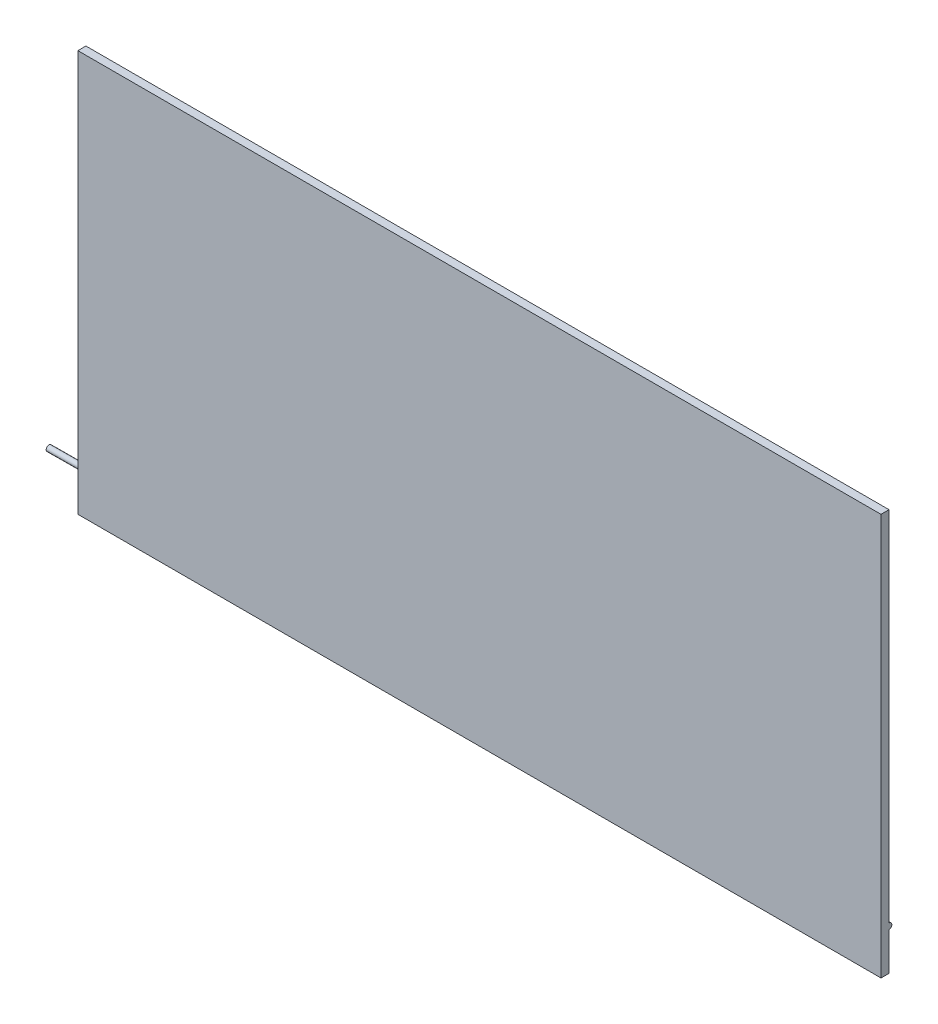
ISO-10303-21;
HEADER;
FILE_DESCRIPTION(('STEP AP214'),'2;1');
FILE_NAME('part.step','',(''),(''),'','','');
FILE_SCHEMA(('AUTOMOTIVE_DESIGN { 1 0 10303 214 1 1 1 1 }'));
ENDSEC;
DATA;
#1=APPLICATION_CONTEXT('core data for automotive mechanical design processes');
#2=APPLICATION_PROTOCOL_DEFINITION('international standard','automotive_design',2000,#1);
#3=PRODUCT_CONTEXT('',#1,'mechanical');
#4=PRODUCT('Part','Part','',(#3));
#5=PRODUCT_RELATED_PRODUCT_CATEGORY('part','',(#4));
#6=PRODUCT_DEFINITION_FORMATION('','',#4);
#7=PRODUCT_DEFINITION_CONTEXT('part definition',#1,'design');
#8=PRODUCT_DEFINITION('design','',#6,#7);
#9=PRODUCT_DEFINITION_SHAPE('','',#8);
#10=(LENGTH_UNIT() NAMED_UNIT(*) SI_UNIT(.MILLI.,.METRE.));
#11=(NAMED_UNIT(*) PLANE_ANGLE_UNIT() SI_UNIT($,.RADIAN.));
#12=(NAMED_UNIT(*) SI_UNIT($,.STERADIAN.) SOLID_ANGLE_UNIT());
#13=UNCERTAINTY_MEASURE_WITH_UNIT(LENGTH_MEASURE(1.E-05),#10,'distance_accuracy_value','');
#14=(GEOMETRIC_REPRESENTATION_CONTEXT(3) GLOBAL_UNCERTAINTY_ASSIGNED_CONTEXT((#13)) GLOBAL_UNIT_ASSIGNED_CONTEXT((#10,
#11,#12)) REPRESENTATION_CONTEXT('',''));
#15=CARTESIAN_POINT('',(0.,0.,0.));
#16=DIRECTION('',(0.,0.,1.));
#17=DIRECTION('',(1.,0.,0.));
#18=AXIS2_PLACEMENT_3D('',#15,#16,#17);
#19=CARTESIAN_POINT('',(0.,0.,0.));
#20=DIRECTION('',(0.,0.,1.));
#21=DIRECTION('',(1.,0.,0.));
#22=AXIS2_PLACEMENT_3D('',#19,#20,#21);
#23=PLANE('',#22);
#24=DIRECTION('',(0.,-1.,0.));
#25=VECTOR('',#24,1.);
#26=CARTESIAN_POINT('',(-520.93023255814,255.813953488372,0.));
#27=LINE('',#26,#25);
#28=CARTESIAN_POINT('',(-520.93023255814,-203.959383487372,0.));
#29=VERTEX_POINT('',#28);
#30=CARTESIAN_POINT('',(-520.93023255814,-244.186046511628,0.));
#31=VERTEX_POINT('',#30);
#32=EDGE_CURVE('E82',#29,#31,#27,.T.);
#33=ORIENTED_EDGE('',*,*,#32,.F.);
#34=DIRECTION('',(0.999975145545196,0.0070504107585743,0.));
#35=VECTOR('',#34,1.);
#36=CARTESIAN_POINT('',(-566.892557240622,-204.28344481017,0.));
#37=LINE('',#36,#35);
#38=CARTESIAN_POINT('',(479.06976744186,-196.908797490327,0.));
#39=VERTEX_POINT('',#38);
#40=EDGE_CURVE('E12',#29,#39,#37,.T.);
#41=ORIENTED_EDGE('',*,*,#40,.T.);
#42=DIRECTION('',(0.,1.,0.));
#43=VECTOR('',#42,1.);
#44=CARTESIAN_POINT('',(479.06976744186,255.813953488372,0.));
#45=LINE('',#44,#43);
#46=CARTESIAN_POINT('',(479.06976744186,-244.186046511628,0.));
#47=VERTEX_POINT('',#46);
#48=EDGE_CURVE('E80',#47,#39,#45,.T.);
#49=ORIENTED_EDGE('',*,*,#48,.F.);
#50=DIRECTION('',(1.,0.,0.));
#51=VECTOR('',#50,1.);
#52=CARTESIAN_POINT('',(-520.93023255814,-244.186046511628,0.));
#53=LINE('',#52,#51);
#54=EDGE_CURVE('E94',#31,#47,#53,.T.);
#55=ORIENTED_EDGE('',*,*,#54,.F.);
#56=EDGE_LOOP('',(#33,#41,#49,#55));
#57=FACE_BOUND('',#56,.T.);
#58=ADVANCED_FACE('F38',(#57),#23,.F.);
#59=CARTESIAN_POINT('',(-520.93023255814,255.813953488372,10.));
#60=DIRECTION('',(1.,0.,0.));
#61=DIRECTION('',(0.,0.,-1.));
#62=AXIS2_PLACEMENT_3D('',#59,#60,#61);
#63=PLANE('',#62);
#64=CARTESIAN_POINT('',(-520.93023255814,255.813953488372,0.));
#65=VERTEX_POINT('',#64);
#66=CARTESIAN_POINT('',(-520.93023255814,-196.959209501864,0.));
#67=VERTEX_POINT('',#66);
#68=EDGE_CURVE('E116',#65,#67,#27,.T.);
#69=ORIENTED_EDGE('',*,*,#68,.T.);
#70=CARTESIAN_POINT('',(-520.93023255814,-200.459296494618,0.));
#71=DIRECTION('',(1.,0.,0.));
#72=DIRECTION('',(0.,1.,0.));
#73=AXIS2_PLACEMENT_3D('',#70,#71,#72);
#74=ELLIPSE('',#73,3.50008699275397,3.5);
#75=EDGE_CURVE('E42',#67,#29,#74,.T.);
#76=ORIENTED_EDGE('',*,*,#75,.T.);
#77=ORIENTED_EDGE('',*,*,#32,.T.);
#78=DIRECTION('',(0.,0.,-1.));
#79=VECTOR('',#78,1.);
#80=CARTESIAN_POINT('',(-520.93023255814,-244.186046511628,10.));
#81=LINE('',#80,#79);
#82=CARTESIAN_POINT('',(-520.93023255814,-244.186046511628,10.));
#83=VERTEX_POINT('',#82);
#84=EDGE_CURVE('E106',#83,#31,#81,.T.);
#85=ORIENTED_EDGE('',*,*,#84,.F.);
#86=DIRECTION('',(0.,-1.,0.));
#87=VECTOR('',#86,1.);
#88=CARTESIAN_POINT('',(-520.93023255814,255.813953488372,10.));
#89=LINE('',#88,#87);
#90=CARTESIAN_POINT('',(-520.93023255814,255.813953488372,10.));
#91=VERTEX_POINT('',#90);
#92=EDGE_CURVE('E92',#91,#83,#89,.T.);
#93=ORIENTED_EDGE('',*,*,#92,.F.);
#94=DIRECTION('',(0.,0.,-1.));
#95=VECTOR('',#94,1.);
#96=CARTESIAN_POINT('',(-520.93023255814,255.813953488372,10.));
#97=LINE('',#96,#95);
#98=EDGE_CURVE('E98',#91,#65,#97,.T.);
#99=ORIENTED_EDGE('',*,*,#98,.T.);
#100=EDGE_LOOP('',(#69,#76,#77,#85,#93,#99));
#101=FACE_BOUND('',#100,.T.);
#102=ADVANCED_FACE('F118',(#101),#63,.F.);
#103=CARTESIAN_POINT('',(-520.93023255814,-244.186046511628,10.));
#104=DIRECTION('',(0.,1.,0.));
#105=DIRECTION('',(0.,0.,1.));
#106=AXIS2_PLACEMENT_3D('',#103,#104,#105);
#107=PLANE('',#106);
#108=ORIENTED_EDGE('',*,*,#54,.T.);
#109=DIRECTION('',(0.,0.,-1.));
#110=VECTOR('',#109,1.);
#111=CARTESIAN_POINT('',(479.06976744186,-244.186046511628,10.));
#112=LINE('',#111,#110);
#113=CARTESIAN_POINT('',(479.06976744186,-244.186046511628,10.));
#114=VERTEX_POINT('',#113);
#115=EDGE_CURVE('E87',#114,#47,#112,.T.);
#116=ORIENTED_EDGE('',*,*,#115,.F.);
#117=DIRECTION('',(1.,0.,0.));
#118=VECTOR('',#117,1.);
#119=CARTESIAN_POINT('',(-520.93023255814,-244.186046511628,10.));
#120=LINE('',#119,#118);
#121=EDGE_CURVE('E127',#83,#114,#120,.T.);
#122=ORIENTED_EDGE('',*,*,#121,.F.);
#123=ORIENTED_EDGE('',*,*,#84,.T.);
#124=EDGE_LOOP('',(#108,#116,#122,#123));
#125=FACE_BOUND('',#124,.T.);
#126=ADVANCED_FACE('F140',(#125),#107,.F.);
#127=CARTESIAN_POINT('',(479.06976744186,255.813953488372,10.));
#128=DIRECTION('',(-1.,0.,0.));
#129=DIRECTION('',(0.,0.,1.));
#130=AXIS2_PLACEMENT_3D('',#127,#128,#129);
#131=PLANE('',#130);
#132=ORIENTED_EDGE('',*,*,#48,.T.);
#133=CARTESIAN_POINT('',(479.06976744186,-193.408710497573,0.));
#134=DIRECTION('',(-1.,0.,0.));
#135=DIRECTION('',(0.,1.,0.));
#136=AXIS2_PLACEMENT_3D('',#133,#134,#135);
#137=ELLIPSE('',#136,3.50008699275397,3.5);
#138=CARTESIAN_POINT('',(479.06976744186,-189.908623504819,0.));
#139=VERTEX_POINT('',#138);
#140=EDGE_CURVE('E57',#39,#139,#137,.F.);
#141=ORIENTED_EDGE('',*,*,#140,.T.);
#142=CARTESIAN_POINT('',(479.06976744186,255.813953488372,0.));
#143=VERTEX_POINT('',#142);
#144=EDGE_CURVE('E89',#139,#143,#45,.T.);
#145=ORIENTED_EDGE('',*,*,#144,.T.);
#146=DIRECTION('',(0.,0.,-1.));
#147=VECTOR('',#146,1.);
#148=CARTESIAN_POINT('',(479.06976744186,255.813953488372,10.));
#149=LINE('',#148,#147);
#150=CARTESIAN_POINT('',(479.06976744186,255.813953488372,10.));
#151=VERTEX_POINT('',#150);
#152=EDGE_CURVE('E101',#151,#143,#149,.T.);
#153=ORIENTED_EDGE('',*,*,#152,.F.);
#154=DIRECTION('',(0.,1.,0.));
#155=VECTOR('',#154,1.);
#156=CARTESIAN_POINT('',(479.06976744186,255.813953488372,10.));
#157=LINE('',#156,#155);
#158=EDGE_CURVE('E124',#114,#151,#157,.T.);
#159=ORIENTED_EDGE('',*,*,#158,.F.);
#160=ORIENTED_EDGE('',*,*,#115,.T.);
#161=EDGE_LOOP('',(#132,#141,#145,#153,#159,#160));
#162=FACE_BOUND('',#161,.T.);
#163=ADVANCED_FACE('F84',(#162),#131,.F.);
#164=CARTESIAN_POINT('',(-520.93023255814,255.813953488372,10.));
#165=DIRECTION('',(0.,-1.,0.));
#166=DIRECTION('',(0.,0.,-1.));
#167=AXIS2_PLACEMENT_3D('',#164,#165,#166);
#168=PLANE('',#167);
#169=DIRECTION('',(-1.,0.,0.));
#170=VECTOR('',#169,1.);
#171=CARTESIAN_POINT('',(-520.93023255814,255.813953488372,0.));
#172=LINE('',#171,#170);
#173=EDGE_CURVE('E88',#143,#65,#172,.T.);
#174=ORIENTED_EDGE('',*,*,#173,.T.);
#175=ORIENTED_EDGE('',*,*,#98,.F.);
#176=DIRECTION('',(-1.,0.,0.));
#177=VECTOR('',#176,1.);
#178=CARTESIAN_POINT('',(-520.93023255814,255.813953488372,10.));
#179=LINE('',#178,#177);
#180=EDGE_CURVE('E102',#151,#91,#179,.T.);
#181=ORIENTED_EDGE('',*,*,#180,.F.);
#182=ORIENTED_EDGE('',*,*,#152,.T.);
#183=EDGE_LOOP('',(#174,#175,#181,#182));
#184=FACE_BOUND('',#183,.T.);
#185=ADVANCED_FACE('F147',(#184),#168,.F.);
#186=CARTESIAN_POINT('',(0.,0.,10.));
#187=DIRECTION('',(0.,0.,1.));
#188=DIRECTION('',(1.,0.,0.));
#189=AXIS2_PLACEMENT_3D('',#186,#187,#188);
#190=PLANE('',#189);
#191=ORIENTED_EDGE('',*,*,#92,.T.);
#192=ORIENTED_EDGE('',*,*,#121,.T.);
#193=ORIENTED_EDGE('',*,*,#158,.T.);
#194=ORIENTED_EDGE('',*,*,#180,.T.);
#195=EDGE_LOOP('',(#191,#192,#193,#194));
#196=FACE_BOUND('',#195,.T.);
#197=ADVANCED_FACE('F134',(#196),#190,.T.);
#198=ORIENTED_EDGE('',*,*,#144,.F.);
#199=DIRECTION('',(0.999975145545196,0.0070504107585743,0.));
#200=VECTOR('',#199,1.);
#201=CARTESIAN_POINT('',(-566.941910115932,-197.283618791354,0.));
#202=LINE('',#201,#200);
#203=EDGE_CURVE('E48',#139,#67,#202,.F.);
#204=ORIENTED_EDGE('',*,*,#203,.T.);
#205=ORIENTED_EDGE('',*,*,#68,.F.);
#206=ORIENTED_EDGE('',*,*,#173,.F.);
#207=EDGE_LOOP('',(#198,#204,#205,#206));
#208=FACE_BOUND('',#207,.T.);
#209=ADVANCED_FACE('F113',(#208),#23,.F.);
#210=CARTESIAN_POINT('',(-566.917233678277,-200.783531800762,0.));
#211=DIRECTION('',(0.999975145545196,0.0070504107585743,0.));
#212=DIRECTION('',(0.,0.,-1.));
#213=AXIS2_PLACEMENT_3D('',#210,#211,#212);
#214=CYLINDRICAL_SURFACE('',#213,3.5);
#215=CARTESIAN_POINT('',(-566.93023255814,-200.783623450482,0.));
#216=DIRECTION('',(1.,0.,0.));
#217=DIRECTION('',(0.,1.,0.));
#218=AXIS2_PLACEMENT_3D('',#215,#216,#217);
#219=ELLIPSE('',#218,3.50008699275397,3.5);
#220=CARTESIAN_POINT('',(-566.93023255814,-197.283536457728,0.));
#221=VERTEX_POINT('',#220);
#222=EDGE_CURVE('E73',#221,#221,#219,.T.);
#223=ORIENTED_EDGE('',*,*,#222,.T.);
#224=EDGE_LOOP('',(#223));
#225=FACE_BOUND('',#224,.T.);
#226=ORIENTED_EDGE('',*,*,#40,.F.);
#227=ORIENTED_EDGE('',*,*,#75,.F.);
#228=ORIENTED_EDGE('',*,*,#203,.F.);
#229=ORIENTED_EDGE('',*,*,#140,.F.);
#230=EDGE_LOOP('',(#226,#227,#228,#229));
#231=FACE_BOUND('',#230,.T.);
#232=ADVANCED_FACE('F40',(#225,#231),#214,.T.);
#233=CARTESIAN_POINT('',(-566.93023255814,-197.096166974027,0.));
#234=DIRECTION('',(1.,0.,0.));
#235=DIRECTION('',(0.,0.,-1.));
#236=AXIS2_PLACEMENT_3D('',#233,#234,#235);
#237=PLANE('',#236);
#238=ORIENTED_EDGE('',*,*,#222,.F.);
#239=EDGE_LOOP('',(#238));
#240=FACE_BOUND('',#239,.T.);
#241=ADVANCED_FACE('F167',(#240),#237,.F.);
#242=CLOSED_SHELL('',(#58,#102,#126,#163,#185,#197,#209,#232,#241));
#243=MANIFOLD_SOLID_BREP('B2',#242);
#244=ADVANCED_BREP_SHAPE_REPRESENTATION('',(#18,#243),#14);
#245=SHAPE_DEFINITION_REPRESENTATION(#9,#244);
ENDSEC;
END-ISO-10303-21;
